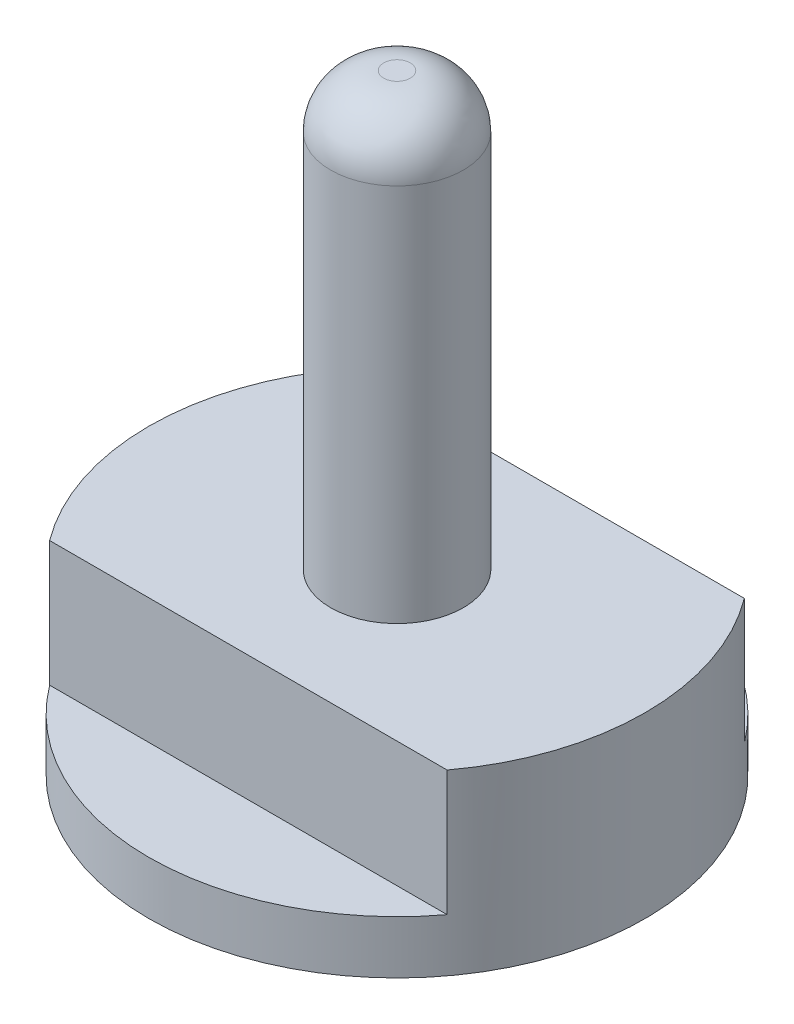
ISO-10303-21;
HEADER;
FILE_DESCRIPTION(('STEP AP214'),'2;1');
FILE_NAME('part.step','',(''),(''),'','','');
FILE_SCHEMA(('AUTOMOTIVE_DESIGN { 1 0 10303 214 1 1 1 1 }'));
ENDSEC;
DATA;
#1=APPLICATION_CONTEXT('core data for automotive mechanical design processes');
#2=APPLICATION_PROTOCOL_DEFINITION('international standard','automotive_design',2000,#1);
#3=PRODUCT_CONTEXT('',#1,'mechanical');
#4=PRODUCT('Part','Part','',(#3));
#5=PRODUCT_RELATED_PRODUCT_CATEGORY('part','',(#4));
#6=PRODUCT_DEFINITION_FORMATION('','',#4);
#7=PRODUCT_DEFINITION_CONTEXT('part definition',#1,'design');
#8=PRODUCT_DEFINITION('design','',#6,#7);
#9=PRODUCT_DEFINITION_SHAPE('','',#8);
#10=(LENGTH_UNIT() NAMED_UNIT(*) SI_UNIT(.MILLI.,.METRE.));
#11=(NAMED_UNIT(*) PLANE_ANGLE_UNIT() SI_UNIT($,.RADIAN.));
#12=(NAMED_UNIT(*) SI_UNIT($,.STERADIAN.) SOLID_ANGLE_UNIT());
#13=UNCERTAINTY_MEASURE_WITH_UNIT(LENGTH_MEASURE(1.E-05),#10,'distance_accuracy_value','');
#14=(GEOMETRIC_REPRESENTATION_CONTEXT(3) GLOBAL_UNCERTAINTY_ASSIGNED_CONTEXT((#13)) GLOBAL_UNIT_ASSIGNED_CONTEXT((#10,
#11,#12)) REPRESENTATION_CONTEXT('',''));
#15=CARTESIAN_POINT('',(0.,0.,0.));
#16=DIRECTION('',(0.,0.,1.));
#17=DIRECTION('',(1.,0.,0.));
#18=AXIS2_PLACEMENT_3D('',#15,#16,#17);
#19=CARTESIAN_POINT('',(3.74374478296798,-10.8987384591062,5.6));
#20=DIRECTION('',(0.,0.,-1.));
#21=DIRECTION('',(0.,1.,0.));
#22=AXIS2_PLACEMENT_3D('',#19,#20,#21);
#23=PLANE('',#22);
#24=DIRECTION('',(-1.,0.,0.));
#25=VECTOR('',#24,1.);
#26=CARTESIAN_POINT('',(3.74374478296798,0.999999999999999,5.6));
#27=LINE('',#26,#25);
#28=CARTESIAN_POINT('',(3.74374478296798,0.999999999999996,5.6));
#29=VERTEX_POINT('',#28);
#30=CARTESIAN_POINT('',(-3.74374478296798,0.999999999999996,5.6));
#31=VERTEX_POINT('',#30);
#32=EDGE_CURVE('E56',#29,#31,#27,.T.);
#33=ORIENTED_EDGE('',*,*,#32,.F.);
#34=DIRECTION('',(0.,1.,0.));
#35=VECTOR('',#34,1.);
#36=CARTESIAN_POINT('',(3.74374478296798,-10.8987384591062,5.6));
#37=LINE('',#36,#35);
#38=CARTESIAN_POINT('',(3.74374478296798,3.36,5.6));
#39=VERTEX_POINT('',#38);
#40=EDGE_CURVE('E102',#29,#39,#37,.T.);
#41=ORIENTED_EDGE('',*,*,#40,.T.);
#42=DIRECTION('',(-1.,0.,0.));
#43=VECTOR('',#42,1.);
#44=CARTESIAN_POINT('',(3.74374478296798,3.36,5.6));
#45=LINE('',#44,#43);
#46=CARTESIAN_POINT('',(-3.74374478296798,3.36,5.6));
#47=VERTEX_POINT('',#46);
#48=EDGE_CURVE('E179',#39,#47,#45,.T.);
#49=ORIENTED_EDGE('',*,*,#48,.T.);
#50=DIRECTION('',(0.,1.,0.));
#51=VECTOR('',#50,1.);
#52=CARTESIAN_POINT('',(-3.74374478296798,-10.8987384591062,5.6));
#53=LINE('',#52,#51);
#54=EDGE_CURVE('E61',#31,#47,#53,.T.);
#55=ORIENTED_EDGE('',*,*,#54,.F.);
#56=EDGE_LOOP('',(#33,#41,#49,#55));
#57=FACE_BOUND('',#56,.T.);
#58=ADVANCED_FACE('F41',(#57),#23,.F.);
#59=CARTESIAN_POINT('',(3.74374478296798,-10.8987384591062,0.));
#60=DIRECTION('',(0.,0.,-1.));
#61=DIRECTION('',(0.,1.,0.));
#62=AXIS2_PLACEMENT_3D('',#59,#60,#61);
#63=PLANE('',#62);
#64=DIRECTION('',(0.,1.,0.));
#65=VECTOR('',#64,1.);
#66=CARTESIAN_POINT('',(3.74374478296798,-10.8987384591062,0.));
#67=LINE('',#66,#65);
#68=CARTESIAN_POINT('',(3.743744782968,1.,0.));
#69=VERTEX_POINT('',#68);
#70=CARTESIAN_POINT('',(3.74374478296798,3.36,0.));
#71=VERTEX_POINT('',#70);
#72=EDGE_CURVE('E92',#69,#71,#67,.T.);
#73=ORIENTED_EDGE('',*,*,#72,.F.);
#74=DIRECTION('',(-1.,0.,0.));
#75=VECTOR('',#74,1.);
#76=CARTESIAN_POINT('',(3.74374478296798,0.999999999999999,0.));
#77=LINE('',#76,#75);
#78=CARTESIAN_POINT('',(-3.74374478296799,1.,0.));
#79=VERTEX_POINT('',#78);
#80=EDGE_CURVE('E79',#69,#79,#77,.T.);
#81=ORIENTED_EDGE('',*,*,#80,.T.);
#82=DIRECTION('',(0.,1.,0.));
#83=VECTOR('',#82,1.);
#84=CARTESIAN_POINT('',(-3.74374478296798,-10.8987384591062,0.));
#85=LINE('',#84,#83);
#86=CARTESIAN_POINT('',(-3.74374478296798,3.36,0.));
#87=VERTEX_POINT('',#86);
#88=EDGE_CURVE('E95',#79,#87,#85,.T.);
#89=ORIENTED_EDGE('',*,*,#88,.T.);
#90=DIRECTION('',(-1.,0.,0.));
#91=VECTOR('',#90,1.);
#92=CARTESIAN_POINT('',(3.74374478296798,3.36,0.));
#93=LINE('',#92,#91);
#94=EDGE_CURVE('E101',#71,#87,#93,.T.);
#95=ORIENTED_EDGE('',*,*,#94,.F.);
#96=EDGE_LOOP('',(#73,#81,#89,#95));
#97=FACE_BOUND('',#96,.T.);
#98=ADVANCED_FACE('F99',(#97),#63,.T.);
#99=CARTESIAN_POINT('',(0.,3.36,2.8));
#100=DIRECTION('',(0.,1.,0.));
#101=DIRECTION('',(0.,0.,1.));
#102=AXIS2_PLACEMENT_3D('',#99,#100,#101);
#103=PLANE('',#102);
#104=CARTESIAN_POINT('',(0.,3.36,2.8));
#105=DIRECTION('',(0.,1.,0.));
#106=DIRECTION('',(0.,0.,1.));
#107=AXIS2_PLACEMENT_3D('',#104,#105,#106);
#108=CIRCLE('',#107,1.25);
#109=CARTESIAN_POINT('',(0.,3.36,4.05));
#110=VERTEX_POINT('',#109);
#111=EDGE_CURVE('E171',#110,#110,#108,.T.);
#112=ORIENTED_EDGE('',*,*,#111,.F.);
#113=EDGE_LOOP('',(#112));
#114=FACE_BOUND('',#113,.T.);
#115=CARTESIAN_POINT('',(0.,3.36,2.8));
#116=DIRECTION('',(0.,1.,0.));
#117=DIRECTION('',(0.,0.,1.));
#118=AXIS2_PLACEMENT_3D('',#115,#116,#117);
#119=CIRCLE('',#118,4.675);
#120=EDGE_CURVE('E174',#87,#47,#119,.T.);
#121=ORIENTED_EDGE('',*,*,#120,.T.);
#122=ORIENTED_EDGE('',*,*,#48,.F.);
#123=CARTESIAN_POINT('',(0.,3.36,2.8));
#124=DIRECTION('',(0.,1.,0.));
#125=DIRECTION('',(0.,0.,1.));
#126=AXIS2_PLACEMENT_3D('',#123,#124,#125);
#127=CIRCLE('',#126,4.675);
#128=EDGE_CURVE('E181',#39,#71,#127,.T.);
#129=ORIENTED_EDGE('',*,*,#128,.T.);
#130=ORIENTED_EDGE('',*,*,#94,.T.);
#131=EDGE_LOOP('',(#121,#122,#129,#130));
#132=FACE_BOUND('',#131,.T.);
#133=ADVANCED_FACE('F135',(#114,#132),#103,.T.);
#134=CARTESIAN_POINT('',(0.,-10.8987384591062,2.8));
#135=DIRECTION('',(0.,1.,0.));
#136=DIRECTION('',(0.,0.,1.));
#137=AXIS2_PLACEMENT_3D('',#134,#135,#136);
#138=CYLINDRICAL_SURFACE('',#137,4.675);
#139=ORIENTED_EDGE('',*,*,#40,.F.);
#140=CARTESIAN_POINT('',(0.,1.,2.8));
#141=DIRECTION('',(0.,-1.,0.));
#142=DIRECTION('',(0.,0.,-1.));
#143=AXIS2_PLACEMENT_3D('',#140,#141,#142);
#144=CIRCLE('',#143,4.67500000000001);
#145=EDGE_CURVE('E86',#29,#31,#144,.T.);
#146=ORIENTED_EDGE('',*,*,#145,.T.);
#147=ORIENTED_EDGE('',*,*,#54,.T.);
#148=ORIENTED_EDGE('',*,*,#120,.F.);
#149=ORIENTED_EDGE('',*,*,#88,.F.);
#150=EDGE_CURVE('E82',#79,#69,#144,.T.);
#151=ORIENTED_EDGE('',*,*,#150,.T.);
#152=ORIENTED_EDGE('',*,*,#72,.T.);
#153=ORIENTED_EDGE('',*,*,#128,.F.);
#154=EDGE_LOOP('',(#139,#146,#147,#148,#149,#151,#152,#153));
#155=FACE_BOUND('',#154,.T.);
#156=CARTESIAN_POINT('',(0.,0.,2.8));
#157=DIRECTION('',(0.,1.,0.));
#158=DIRECTION('',(0.,0.,1.));
#159=AXIS2_PLACEMENT_3D('',#156,#157,#158);
#160=CIRCLE('',#159,4.675);
#161=CARTESIAN_POINT('',(0.,0.,7.475));
#162=VERTEX_POINT('',#161);
#163=EDGE_CURVE('E104',#162,#162,#160,.F.);
#164=ORIENTED_EDGE('',*,*,#163,.F.);
#165=EDGE_LOOP('',(#164));
#166=FACE_BOUND('',#165,.T.);
#167=ADVANCED_FACE('F89',(#155,#166),#138,.T.);
#168=CARTESIAN_POINT('',(0.,0.,2.8));
#169=DIRECTION('',(0.,1.,0.));
#170=DIRECTION('',(-1.,0.,0.));
#171=AXIS2_PLACEMENT_3D('',#168,#169,#170);
#172=PLANE('',#171);
#173=CARTESIAN_POINT('',(0.,0.,2.8));
#174=DIRECTION('',(0.,1.,0.));
#175=DIRECTION('',(0.,0.,1.));
#176=AXIS2_PLACEMENT_3D('',#173,#174,#175);
#177=CIRCLE('',#176,1.67500000000001);
#178=CARTESIAN_POINT('',(0.,0.,4.47500000000001));
#179=VERTEX_POINT('',#178);
#180=EDGE_CURVE('E11',#179,#179,#177,.F.);
#181=ORIENTED_EDGE('',*,*,#180,.F.);
#182=EDGE_LOOP('',(#181));
#183=FACE_BOUND('',#182,.T.);
#184=ORIENTED_EDGE('',*,*,#163,.T.);
#185=EDGE_LOOP('',(#184));
#186=FACE_BOUND('',#185,.T.);
#187=ADVANCED_FACE('F128',(#183,#186),#172,.F.);
#188=CARTESIAN_POINT('',(0.,11.5,2.8));
#189=DIRECTION('',(0.,-1.,0.));
#190=DIRECTION('',(0.,0.,-1.));
#191=AXIS2_PLACEMENT_3D('',#188,#189,#190);
#192=CYLINDRICAL_SURFACE('',#191,1.25);
#193=CARTESIAN_POINT('',(0.,10.5,2.8));
#194=DIRECTION('',(0.,1.,0.));
#195=DIRECTION('',(0.,0.,1.));
#196=AXIS2_PLACEMENT_3D('',#193,#194,#195);
#197=CIRCLE('',#196,1.25);
#198=CARTESIAN_POINT('',(0.,10.5,4.05));
#199=VERTEX_POINT('',#198);
#200=EDGE_CURVE('E49',#199,#199,#197,.F.);
#201=ORIENTED_EDGE('',*,*,#200,.T.);
#202=EDGE_LOOP('',(#201));
#203=FACE_BOUND('',#202,.T.);
#204=ORIENTED_EDGE('',*,*,#111,.T.);
#205=EDGE_LOOP('',(#204));
#206=FACE_BOUND('',#205,.T.);
#207=ADVANCED_FACE('F115',(#203,#206),#192,.T.);
#208=CARTESIAN_POINT('',(0.,11.5,2.8));
#209=DIRECTION('',(0.,1.,0.));
#210=DIRECTION('',(0.,0.,1.));
#211=AXIS2_PLACEMENT_3D('',#208,#209,#210);
#212=PLANE('',#211);
#213=CARTESIAN_POINT('',(0.,11.5,2.8));
#214=DIRECTION('',(0.,1.,0.));
#215=DIRECTION('',(0.,0.,1.));
#216=AXIS2_PLACEMENT_3D('',#213,#214,#215);
#217=CIRCLE('',#216,0.25);
#218=CARTESIAN_POINT('',(0.,11.5,3.05));
#219=VERTEX_POINT('',#218);
#220=EDGE_CURVE('E110',#219,#219,#217,.T.);
#221=ORIENTED_EDGE('',*,*,#220,.T.);
#222=EDGE_LOOP('',(#221));
#223=FACE_BOUND('',#222,.T.);
#224=ADVANCED_FACE('F120',(#223),#212,.T.);
#225=CARTESIAN_POINT('',(0.,10.5,2.8));
#226=DIRECTION('',(0.,1.,0.));
#227=DIRECTION('',(0.,0.,1.));
#228=AXIS2_PLACEMENT_3D('',#225,#226,#227);
#229=DEGENERATE_TOROIDAL_SURFACE('',#228,0.25,1.,.T.);
#230=ORIENTED_EDGE('',*,*,#200,.F.);
#231=EDGE_LOOP('',(#230));
#232=FACE_BOUND('',#231,.T.);
#233=ORIENTED_EDGE('',*,*,#220,.F.);
#234=EDGE_LOOP('',(#233));
#235=FACE_BOUND('',#234,.T.);
#236=ADVANCED_FACE('F43',(#232,#235),#229,.T.);
#237=CARTESIAN_POINT('',(0.,1.,2.8));
#238=DIRECTION('',(0.,-1.,0.));
#239=DIRECTION('',(0.,0.,-1.));
#240=AXIS2_PLACEMENT_3D('',#237,#238,#239);
#241=PLANE('',#240);
#242=ORIENTED_EDGE('',*,*,#80,.F.);
#243=ORIENTED_EDGE('',*,*,#150,.F.);
#244=EDGE_LOOP('',(#242,#243));
#245=FACE_BOUND('',#244,.T.);
#246=ADVANCED_FACE('F81',(#245),#241,.F.);
#247=ORIENTED_EDGE('',*,*,#145,.F.);
#248=ORIENTED_EDGE('',*,*,#32,.T.);
#249=EDGE_LOOP('',(#247,#248));
#250=FACE_BOUND('',#249,.T.);
#251=ADVANCED_FACE('F187',(#250),#241,.F.);
#252=CARTESIAN_POINT('',(0.,-2.,2.8));
#253=DIRECTION('',(0.,-1.,0.));
#254=DIRECTION('',(0.,0.,-1.));
#255=AXIS2_PLACEMENT_3D('',#252,#253,#254);
#256=PLANE('',#255);
#257=CARTESIAN_POINT('',(0.,-2.,2.8));
#258=DIRECTION('',(0.,-1.,0.));
#259=DIRECTION('',(0.,0.,-1.));
#260=AXIS2_PLACEMENT_3D('',#257,#258,#259);
#261=CIRCLE('',#260,1.67500000000001);
#262=CARTESIAN_POINT('',(0.,-2.,1.12499999999999));
#263=VERTEX_POINT('',#262);
#264=EDGE_CURVE('E96',#263,#263,#261,.T.);
#265=ORIENTED_EDGE('',*,*,#264,.T.);
#266=EDGE_LOOP('',(#265));
#267=FACE_BOUND('',#266,.T.);
#268=CARTESIAN_POINT('',(0.,-2.,2.8));
#269=DIRECTION('',(0.,-1.,0.));
#270=DIRECTION('',(0.,0.,-1.));
#271=AXIS2_PLACEMENT_3D('',#268,#269,#270);
#272=CIRCLE('',#271,1.17500000000001);
#273=CARTESIAN_POINT('',(0.,-2.,1.62499999999999));
#274=VERTEX_POINT('',#273);
#275=EDGE_CURVE('E163',#274,#274,#272,.T.);
#276=ORIENTED_EDGE('',*,*,#275,.F.);
#277=EDGE_LOOP('',(#276));
#278=FACE_BOUND('',#277,.T.);
#279=ADVANCED_FACE('F189',(#267,#278),#256,.T.);
#280=CARTESIAN_POINT('',(0.,-2.,2.8));
#281=DIRECTION('',(0.,1.,0.));
#282=DIRECTION('',(0.,0.,1.));
#283=AXIS2_PLACEMENT_3D('',#280,#281,#282);
#284=CYLINDRICAL_SURFACE('',#283,1.67500000000001);
#285=ORIENTED_EDGE('',*,*,#264,.F.);
#286=EDGE_LOOP('',(#285));
#287=FACE_BOUND('',#286,.T.);
#288=ORIENTED_EDGE('',*,*,#180,.T.);
#289=EDGE_LOOP('',(#288));
#290=FACE_BOUND('',#289,.T.);
#291=ADVANCED_FACE('F156',(#287,#290),#284,.T.);
#292=CARTESIAN_POINT('',(0.,-2.,2.8));
#293=DIRECTION('',(0.,1.,0.));
#294=DIRECTION('',(0.,0.,1.));
#295=AXIS2_PLACEMENT_3D('',#292,#293,#294);
#296=CYLINDRICAL_SURFACE('',#295,1.17500000000001);
#297=ORIENTED_EDGE('',*,*,#275,.T.);
#298=EDGE_LOOP('',(#297));
#299=FACE_BOUND('',#298,.T.);
#300=CARTESIAN_POINT('',(0.,0.,2.8));
#301=DIRECTION('',(0.,-1.,0.));
#302=DIRECTION('',(0.,0.,-1.));
#303=AXIS2_PLACEMENT_3D('',#300,#301,#302);
#304=CIRCLE('',#303,1.17500000000001);
#305=CARTESIAN_POINT('',(0.,0.,1.62499999999999));
#306=VERTEX_POINT('',#305);
#307=EDGE_CURVE('E161',#306,#306,#304,.T.);
#308=ORIENTED_EDGE('',*,*,#307,.F.);
#309=EDGE_LOOP('',(#308));
#310=FACE_BOUND('',#309,.T.);
#311=ADVANCED_FACE('F151',(#299,#310),#296,.F.);
#312=ORIENTED_EDGE('',*,*,#307,.T.);
#313=EDGE_LOOP('',(#312));
#314=FACE_BOUND('',#313,.T.);
#315=ADVANCED_FACE('F145',(#314),#172,.F.);
#316=CLOSED_SHELL('',(#58,#98,#133,#167,#187,#207,#224,#236,#246,#251,#279,#291,#311,#315));
#317=MANIFOLD_SOLID_BREP('B2',#316);
#318=ADVANCED_BREP_SHAPE_REPRESENTATION('',(#18,#317),#14);
#319=SHAPE_DEFINITION_REPRESENTATION(#9,#318);
ENDSEC;
END-ISO-10303-21;
